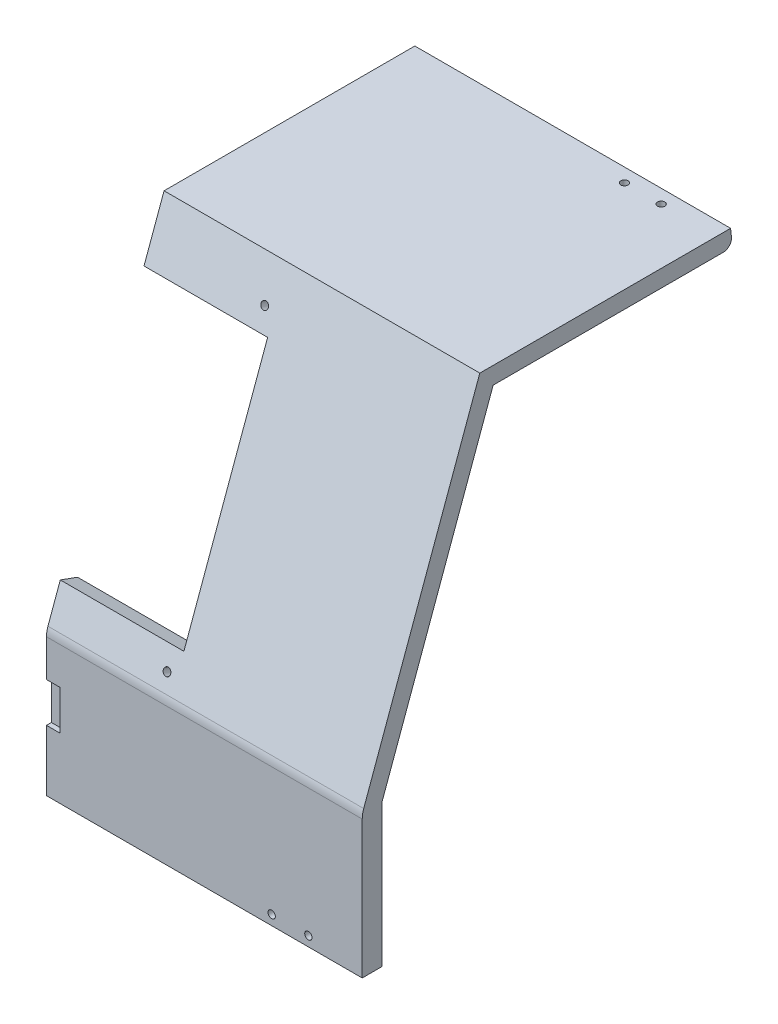
ISO-10303-21;
HEADER;
FILE_DESCRIPTION(('STEP AP214'),'2;1');
FILE_NAME('part.step','',(''),(''),'','','');
FILE_SCHEMA(('AUTOMOTIVE_DESIGN { 1 0 10303 214 1 1 1 1 }'));
ENDSEC;
DATA;
#1=APPLICATION_CONTEXT('core data for automotive mechanical design processes');
#2=APPLICATION_PROTOCOL_DEFINITION('international standard','automotive_design',2000,#1);
#3=PRODUCT_CONTEXT('',#1,'mechanical');
#4=PRODUCT('Part','Part','',(#3));
#5=PRODUCT_RELATED_PRODUCT_CATEGORY('part','',(#4));
#6=PRODUCT_DEFINITION_FORMATION('','',#4);
#7=PRODUCT_DEFINITION_CONTEXT('part definition',#1,'design');
#8=PRODUCT_DEFINITION('design','',#6,#7);
#9=PRODUCT_DEFINITION_SHAPE('','',#8);
#10=(LENGTH_UNIT() NAMED_UNIT(*) SI_UNIT(.MILLI.,.METRE.));
#11=(NAMED_UNIT(*) PLANE_ANGLE_UNIT() SI_UNIT($,.RADIAN.));
#12=(NAMED_UNIT(*) SI_UNIT($,.STERADIAN.) SOLID_ANGLE_UNIT());
#13=UNCERTAINTY_MEASURE_WITH_UNIT(LENGTH_MEASURE(1.E-05),#10,'distance_accuracy_value','');
#14=(GEOMETRIC_REPRESENTATION_CONTEXT(3) GLOBAL_UNCERTAINTY_ASSIGNED_CONTEXT((#13)) GLOBAL_UNIT_ASSIGNED_CONTEXT((#10,
#11,#12)) REPRESENTATION_CONTEXT('',''));
#15=CARTESIAN_POINT('',(0.,0.,0.));
#16=DIRECTION('',(0.,0.,1.));
#17=DIRECTION('',(1.,0.,0.));
#18=AXIS2_PLACEMENT_3D('',#15,#16,#17);
#19=CARTESIAN_POINT('',(0.,-43.,0.));
#20=DIRECTION('',(0.,-1.,0.));
#21=DIRECTION('',(1.,0.,0.));
#22=AXIS2_PLACEMENT_3D('',#19,#20,#21);
#23=PLANE('',#22);
#24=DIRECTION('',(0.,0.,1.));
#25=VECTOR('',#24,1.);
#26=CARTESIAN_POINT('',(112.,-43.,-214.));
#27=LINE('',#26,#25);
#28=CARTESIAN_POINT('',(112.,-43.,0.));
#29=VERTEX_POINT('',#28);
#30=CARTESIAN_POINT('',(112.,-43.,8.));
#31=VERTEX_POINT('',#30);
#32=EDGE_CURVE('E175',#29,#31,#27,.T.);
#33=ORIENTED_EDGE('',*,*,#32,.F.);
#34=DIRECTION('',(-1.,0.,0.));
#35=VECTOR('',#34,1.);
#36=CARTESIAN_POINT('',(372.,-43.,0.));
#37=LINE('',#36,#35);
#38=CARTESIAN_POINT('',(241.,-43.,0.));
#39=VERTEX_POINT('',#38);
#40=EDGE_CURVE('E370',#39,#29,#37,.T.);
#41=ORIENTED_EDGE('',*,*,#40,.F.);
#42=DIRECTION('',(0.,0.,-1.));
#43=VECTOR('',#42,1.);
#44=CARTESIAN_POINT('',(241.,-43.,8.));
#45=LINE('',#44,#43);
#46=CARTESIAN_POINT('',(241.,-43.,8.));
#47=VERTEX_POINT('',#46);
#48=EDGE_CURVE('E200',#47,#39,#45,.T.);
#49=ORIENTED_EDGE('',*,*,#48,.F.);
#50=DIRECTION('',(-1.,0.,0.));
#51=VECTOR('',#50,1.);
#52=CARTESIAN_POINT('',(232.,-43.,8.));
#53=LINE('',#52,#51);
#54=EDGE_CURVE('E193',#47,#31,#53,.T.);
#55=ORIENTED_EDGE('',*,*,#54,.T.);
#56=EDGE_LOOP('',(#33,#41,#49,#55));
#57=FACE_BOUND('',#56,.T.);
#58=ADVANCED_FACE('F40',(#57),#23,.T.);
#59=CARTESIAN_POINT('',(0.,0.,6.));
#60=DIRECTION('',(0.,0.,-1.));
#61=DIRECTION('',(-1.,0.,0.));
#62=AXIS2_PLACEMENT_3D('',#59,#60,#61);
#63=PLANE('',#62);
#64=DIRECTION('',(-1.,0.,0.));
#65=VECTOR('',#64,1.);
#66=CARTESIAN_POINT('',(52.5,-1.9,6.));
#67=LINE('',#66,#65);
#68=CARTESIAN_POINT('',(117.5,-1.89999999999999,6.));
#69=VERTEX_POINT('',#68);
#70=CARTESIAN_POINT('',(112.,-1.89999999999999,6.));
#71=VERTEX_POINT('',#70);
#72=EDGE_CURVE('E215',#69,#71,#67,.T.);
#73=ORIENTED_EDGE('',*,*,#72,.T.);
#74=DIRECTION('',(0.,-1.,0.));
#75=VECTOR('',#74,1.);
#76=CARTESIAN_POINT('',(112.,0.,6.));
#77=LINE('',#76,#75);
#78=CARTESIAN_POINT('',(112.,-18.1,6.));
#79=VERTEX_POINT('',#78);
#80=EDGE_CURVE('E815',#71,#79,#77,.T.);
#81=ORIENTED_EDGE('',*,*,#80,.T.);
#82=DIRECTION('',(1.,0.,0.));
#83=VECTOR('',#82,1.);
#84=CARTESIAN_POINT('',(117.5,-18.1,6.));
#85=LINE('',#84,#83);
#86=CARTESIAN_POINT('',(117.5,-18.1,6.));
#87=VERTEX_POINT('',#86);
#88=EDGE_CURVE('E219',#79,#87,#85,.T.);
#89=ORIENTED_EDGE('',*,*,#88,.T.);
#90=DIRECTION('',(0.,1.,0.));
#91=VECTOR('',#90,1.);
#92=CARTESIAN_POINT('',(117.5,-1.89999999999999,6.));
#93=LINE('',#92,#91);
#94=EDGE_CURVE('E223',#87,#69,#93,.T.);
#95=ORIENTED_EDGE('',*,*,#94,.T.);
#96=EDGE_LOOP('',(#73,#81,#89,#95));
#97=FACE_BOUND('',#96,.T.);
#98=ADVANCED_FACE('F420',(#97),#63,.F.);
#99=CARTESIAN_POINT('',(0.,0.,8.));
#100=DIRECTION('',(0.,0.,1.));
#101=DIRECTION('',(1.,0.,0.));
#102=AXIS2_PLACEMENT_3D('',#99,#100,#101);
#103=PLANE('',#102);
#104=DIRECTION('',(0.,1.,0.));
#105=VECTOR('',#104,1.);
#106=CARTESIAN_POINT('',(112.,-43.,8.));
#107=LINE('',#106,#105);
#108=CARTESIAN_POINT('',(112.,-18.1,8.));
#109=VERTEX_POINT('',#108);
#110=EDGE_CURVE('E178',#31,#109,#107,.T.);
#111=ORIENTED_EDGE('',*,*,#110,.F.);
#112=ORIENTED_EDGE('',*,*,#54,.F.);
#113=DIRECTION('',(0.,-1.,0.));
#114=VECTOR('',#113,1.);
#115=CARTESIAN_POINT('',(241.,13.2367301929154,8.));
#116=LINE('',#115,#114);
#117=CARTESIAN_POINT('',(241.,13.2367301929154,8.));
#118=VERTEX_POINT('',#117);
#119=EDGE_CURVE('E307',#118,#47,#116,.T.);
#120=ORIENTED_EDGE('',*,*,#119,.F.);
#121=DIRECTION('',(1.,0.,0.));
#122=VECTOR('',#121,1.);
#123=CARTESIAN_POINT('',(-17.,13.2367301929154,8.));
#124=LINE('',#123,#122);
#125=CARTESIAN_POINT('',(112.,13.2367301929154,8.));
#126=VERTEX_POINT('',#125);
#127=EDGE_CURVE('E264',#118,#126,#124,.F.);
#128=ORIENTED_EDGE('',*,*,#127,.T.);
#129=CARTESIAN_POINT('',(112.,-1.9,8.));
#130=VERTEX_POINT('',#129);
#131=EDGE_CURVE('E56',#130,#126,#107,.T.);
#132=ORIENTED_EDGE('',*,*,#131,.F.);
#133=DIRECTION('',(-1.,0.,0.));
#134=VECTOR('',#133,1.);
#135=CARTESIAN_POINT('',(52.5,-1.9,8.));
#136=LINE('',#135,#134);
#137=CARTESIAN_POINT('',(117.5,-1.89999999999999,8.));
#138=VERTEX_POINT('',#137);
#139=EDGE_CURVE('E203',#138,#130,#136,.T.);
#140=ORIENTED_EDGE('',*,*,#139,.F.);
#141=DIRECTION('',(0.,1.,0.));
#142=VECTOR('',#141,1.);
#143=CARTESIAN_POINT('',(117.5,-1.89999999999999,8.));
#144=LINE('',#143,#142);
#145=CARTESIAN_POINT('',(117.5,-18.1,8.));
#146=VERTEX_POINT('',#145);
#147=EDGE_CURVE('E220',#146,#138,#144,.T.);
#148=ORIENTED_EDGE('',*,*,#147,.F.);
#149=DIRECTION('',(1.,0.,0.));
#150=VECTOR('',#149,1.);
#151=CARTESIAN_POINT('',(117.5,-18.1,8.));
#152=LINE('',#151,#150);
#153=EDGE_CURVE('E196',#109,#146,#152,.T.);
#154=ORIENTED_EDGE('',*,*,#153,.F.);
#155=EDGE_LOOP('',(#111,#112,#120,#128,#132,#140,#148,#154));
#156=FACE_BOUND('',#155,.T.);
#157=CARTESIAN_POINT('',(219.,-39.,8.));
#158=DIRECTION('',(0.,0.,1.));
#159=DIRECTION('',(1.,0.,0.));
#160=AXIS2_PLACEMENT_3D('',#157,#158,#159);
#161=CIRCLE('',#160,1.5);
#162=CARTESIAN_POINT('',(220.5,-39.,8.));
#163=VERTEX_POINT('',#162);
#164=EDGE_CURVE('E281',#163,#163,#161,.T.);
#165=ORIENTED_EDGE('',*,*,#164,.F.);
#166=EDGE_LOOP('',(#165));
#167=FACE_BOUND('',#166,.T.);
#168=CARTESIAN_POINT('',(204.,-39.,8.));
#169=DIRECTION('',(0.,0.,1.));
#170=DIRECTION('',(1.,0.,0.));
#171=AXIS2_PLACEMENT_3D('',#168,#169,#170);
#172=CIRCLE('',#171,1.5);
#173=CARTESIAN_POINT('',(205.5,-39.,8.));
#174=VERTEX_POINT('',#173);
#175=EDGE_CURVE('E806',#174,#174,#172,.T.);
#176=ORIENTED_EDGE('',*,*,#175,.F.);
#177=EDGE_LOOP('',(#176));
#178=FACE_BOUND('',#177,.T.);
#179=ADVANCED_FACE('F190',(#156,#167,#178),#103,.T.);
#180=CARTESIAN_POINT('',(0.,0.,0.));
#181=DIRECTION('',(0.,0.,1.));
#182=DIRECTION('',(1.,0.,0.));
#183=AXIS2_PLACEMENT_3D('',#180,#181,#182);
#184=PLANE('',#183);
#185=CARTESIAN_POINT('',(219.,-39.,0.));
#186=DIRECTION('',(0.,0.,1.));
#187=DIRECTION('',(1.,0.,0.));
#188=AXIS2_PLACEMENT_3D('',#185,#186,#187);
#189=CIRCLE('',#188,1.5);
#190=CARTESIAN_POINT('',(220.5,-39.,0.));
#191=VERTEX_POINT('',#190);
#192=EDGE_CURVE('E280',#191,#191,#189,.T.);
#193=ORIENTED_EDGE('',*,*,#192,.T.);
#194=EDGE_LOOP('',(#193));
#195=FACE_BOUND('',#194,.T.);
#196=CARTESIAN_POINT('',(204.,-39.,0.));
#197=DIRECTION('',(0.,0.,1.));
#198=DIRECTION('',(1.,0.,0.));
#199=AXIS2_PLACEMENT_3D('',#196,#197,#198);
#200=CIRCLE('',#199,1.5);
#201=CARTESIAN_POINT('',(205.5,-39.,0.));
#202=VERTEX_POINT('',#201);
#203=EDGE_CURVE('E277',#202,#202,#200,.T.);
#204=ORIENTED_EDGE('',*,*,#203,.T.);
#205=EDGE_LOOP('',(#204));
#206=FACE_BOUND('',#205,.T.);
#207=ORIENTED_EDGE('',*,*,#40,.T.);
#208=DIRECTION('',(0.,1.,0.));
#209=VECTOR('',#208,1.);
#210=CARTESIAN_POINT('',(112.,0.,0.));
#211=LINE('',#210,#209);
#212=CARTESIAN_POINT('',(112.,15.,0.));
#213=VERTEX_POINT('',#212);
#214=EDGE_CURVE('E181',#29,#213,#211,.T.);
#215=ORIENTED_EDGE('',*,*,#214,.T.);
#216=DIRECTION('',(1.,0.,0.));
#217=VECTOR('',#216,1.);
#218=CARTESIAN_POINT('',(0.,15.,0.));
#219=LINE('',#218,#217);
#220=CARTESIAN_POINT('',(241.,15.,0.));
#221=VERTEX_POINT('',#220);
#222=EDGE_CURVE('E236',#213,#221,#219,.T.);
#223=ORIENTED_EDGE('',*,*,#222,.T.);
#224=DIRECTION('',(0.,1.,0.));
#225=VECTOR('',#224,1.);
#226=CARTESIAN_POINT('',(241.,-43.,0.));
#227=LINE('',#226,#225);
#228=EDGE_CURVE('E313',#39,#221,#227,.T.);
#229=ORIENTED_EDGE('',*,*,#228,.F.);
#230=EDGE_LOOP('',(#207,#215,#223,#229));
#231=FACE_BOUND('',#230,.T.);
#232=ADVANCED_FACE('F433',(#195,#206,#231),#184,.F.);
#233=CARTESIAN_POINT('',(52.5,-1.9,6.));
#234=DIRECTION('',(0.,1.,0.));
#235=DIRECTION('',(-1.,0.,0.));
#236=AXIS2_PLACEMENT_3D('',#233,#234,#235);
#237=PLANE('',#236);
#238=ORIENTED_EDGE('',*,*,#139,.T.);
#239=DIRECTION('',(0.,0.,-1.));
#240=VECTOR('',#239,1.);
#241=CARTESIAN_POINT('',(112.,-1.9,6.));
#242=LINE('',#241,#240);
#243=EDGE_CURVE('E810',#130,#71,#242,.T.);
#244=ORIENTED_EDGE('',*,*,#243,.T.);
#245=ORIENTED_EDGE('',*,*,#72,.F.);
#246=DIRECTION('',(0.,0.,1.));
#247=VECTOR('',#246,1.);
#248=CARTESIAN_POINT('',(117.5,-1.89999999999999,6.));
#249=LINE('',#248,#247);
#250=EDGE_CURVE('E233',#69,#138,#249,.T.);
#251=ORIENTED_EDGE('',*,*,#250,.T.);
#252=EDGE_LOOP('',(#238,#244,#245,#251));
#253=FACE_BOUND('',#252,.T.);
#254=ADVANCED_FACE('F428',(#253),#237,.F.);
#255=CARTESIAN_POINT('',(117.5,-1.89999999999999,6.));
#256=DIRECTION('',(1.,0.,0.));
#257=DIRECTION('',(0.,1.,0.));
#258=AXIS2_PLACEMENT_3D('',#255,#256,#257);
#259=PLANE('',#258);
#260=ORIENTED_EDGE('',*,*,#147,.T.);
#261=ORIENTED_EDGE('',*,*,#250,.F.);
#262=ORIENTED_EDGE('',*,*,#94,.F.);
#263=DIRECTION('',(0.,0.,1.));
#264=VECTOR('',#263,1.);
#265=CARTESIAN_POINT('',(117.5,-18.1,6.));
#266=LINE('',#265,#264);
#267=EDGE_CURVE('E226',#87,#146,#266,.T.);
#268=ORIENTED_EDGE('',*,*,#267,.T.);
#269=EDGE_LOOP('',(#260,#261,#262,#268));
#270=FACE_BOUND('',#269,.T.);
#271=ADVANCED_FACE('F413',(#270),#259,.F.);
#272=CARTESIAN_POINT('',(117.5,-18.1,6.));
#273=DIRECTION('',(0.,-1.,0.));
#274=DIRECTION('',(1.,0.,0.));
#275=AXIS2_PLACEMENT_3D('',#272,#273,#274);
#276=PLANE('',#275);
#277=ORIENTED_EDGE('',*,*,#88,.F.);
#278=DIRECTION('',(0.,0.,1.));
#279=VECTOR('',#278,1.);
#280=CARTESIAN_POINT('',(112.,-18.1,6.));
#281=LINE('',#280,#279);
#282=EDGE_CURVE('E819',#79,#109,#281,.T.);
#283=ORIENTED_EDGE('',*,*,#282,.T.);
#284=ORIENTED_EDGE('',*,*,#153,.T.);
#285=ORIENTED_EDGE('',*,*,#267,.F.);
#286=EDGE_LOOP('',(#277,#283,#284,#285));
#287=FACE_BOUND('',#286,.T.);
#288=ADVANCED_FACE('F404',(#287),#276,.F.);
#289=CARTESIAN_POINT('',(367.966363109241,15.,8.));
#290=DIRECTION('',(0.,-0.34202014332566,-0.939692620785911));
#291=DIRECTION('',(0.,0.939692620785912,-0.34202014332566));
#292=AXIS2_PLACEMENT_3D('',#289,#290,#291);
#293=PLANE('',#292);
#294=CARTESIAN_POINT('',(158.45,22.6689355771421,5.20873572141525));
#295=DIRECTION('',(0.,0.34202014332566,0.939692620785912));
#296=DIRECTION('',(0.,-0.939692620785912,0.34202014332566));
#297=AXIS2_PLACEMENT_3D('',#294,#295,#296);
#298=CIRCLE('',#297,1.5);
#299=CARTESIAN_POINT('',(158.45,21.2593966459633,5.72176593640374));
#300=VERTEX_POINT('',#299);
#301=EDGE_CURVE('E374',#300,#300,#298,.T.);
#302=ORIENTED_EDGE('',*,*,#301,.F.);
#303=EDGE_LOOP('',(#302));
#304=FACE_BOUND('',#303,.T.);
#305=DIRECTION('',(1.,0.,0.));
#306=VECTOR('',#305,1.);
#307=CARTESIAN_POINT('',(-24.4492444073313,147.,-40.0440709231374));
#308=LINE('',#307,#306);
#309=CARTESIAN_POINT('',(112.,147.,-40.0440709231374));
#310=VERTEX_POINT('',#309);
#311=CARTESIAN_POINT('',(241.,147.,-40.0440709231374));
#312=VERTEX_POINT('',#311);
#313=EDGE_CURVE('E359',#310,#312,#308,.T.);
#314=ORIENTED_EDGE('',*,*,#313,.F.);
#315=DIRECTION('',(0.,-0.939692620785912,0.34202014332566));
#316=VECTOR('',#315,1.);
#317=CARTESIAN_POINT('',(112.,15.,8.00000000000001));
#318=LINE('',#317,#316);
#319=CARTESIAN_POINT('',(112.,124.484631039296,-31.84914680792));
#320=VERTEX_POINT('',#319);
#321=EDGE_CURVE('E459',#310,#320,#318,.T.);
#322=ORIENTED_EDGE('',*,*,#321,.T.);
#323=DIRECTION('',(-1.,0.,0.));
#324=VECTOR('',#323,1.);
#325=CARTESIAN_POINT('',(162.5,124.484631039296,-31.8491468079201));
#326=LINE('',#325,#324);
#327=CARTESIAN_POINT('',(162.5,124.484631039296,-31.8491468079201));
#328=VERTEX_POINT('',#327);
#329=EDGE_CURVE('E373',#328,#320,#326,.T.);
#330=ORIENTED_EDGE('',*,*,#329,.F.);
#331=DIRECTION('',(0.,0.939692620785912,-0.34202014332566));
#332=VECTOR('',#331,1.);
#333=CARTESIAN_POINT('',(162.5,30.5153689607045,2.35286752464598));
#334=LINE('',#333,#332);
#335=CARTESIAN_POINT('',(162.5,30.5153689607045,2.35286752464598));
#336=VERTEX_POINT('',#335);
#337=EDGE_CURVE('E385',#336,#328,#334,.T.);
#338=ORIENTED_EDGE('',*,*,#337,.F.);
#339=DIRECTION('',(1.,0.,0.));
#340=VECTOR('',#339,1.);
#341=CARTESIAN_POINT('',(-2.49999999999994,30.5153689607045,2.35286752464599));
#342=LINE('',#341,#340);
#343=CARTESIAN_POINT('',(112.,30.5153689607045,2.35286752464598));
#344=VERTEX_POINT('',#343);
#345=EDGE_CURVE('E382',#344,#336,#342,.T.);
#346=ORIENTED_EDGE('',*,*,#345,.F.);
#347=CARTESIAN_POINT('',(112.,16.656931626172,7.39692620785912));
#348=VERTEX_POINT('',#347);
#349=EDGE_CURVE('E458',#344,#348,#318,.T.);
#350=ORIENTED_EDGE('',*,*,#349,.T.);
#351=DIRECTION('',(1.,0.,0.));
#352=VECTOR('',#351,1.);
#353=CARTESIAN_POINT('',(232.,16.656931626172,7.39692620785912));
#354=LINE('',#353,#352);
#355=CARTESIAN_POINT('',(241.,16.656931626172,7.39692620785912));
#356=VERTEX_POINT('',#355);
#357=EDGE_CURVE('E258',#348,#356,#354,.T.);
#358=ORIENTED_EDGE('',*,*,#357,.T.);
#359=DIRECTION('',(0.,-0.939692620785912,0.34202014332566));
#360=VECTOR('',#359,1.);
#361=CARTESIAN_POINT('',(241.,147.,-40.0440709231374));
#362=LINE('',#361,#360);
#363=EDGE_CURVE('E334',#312,#356,#362,.T.);
#364=ORIENTED_EDGE('',*,*,#363,.F.);
#365=EDGE_LOOP('',(#314,#322,#330,#338,#346,#350,#358,#364));
#366=FACE_BOUND('',#365,.T.);
#367=CARTESIAN_POINT('',(158.45,132.331064422858,-34.7050150046893));
#368=DIRECTION('',(0.,0.34202014332566,0.939692620785912));
#369=DIRECTION('',(0.,-0.939692620785912,0.34202014332566));
#370=AXIS2_PLACEMENT_3D('',#367,#368,#369);
#371=CIRCLE('',#370,1.5);
#372=CARTESIAN_POINT('',(158.45,130.921525491679,-34.1919847897008));
#373=VERTEX_POINT('',#372);
#374=EDGE_CURVE('E247',#373,#373,#371,.T.);
#375=ORIENTED_EDGE('',*,*,#374,.F.);
#376=EDGE_LOOP('',(#375));
#377=FACE_BOUND('',#376,.T.);
#378=ADVANCED_FACE('F401',(#304,#366,#377),#293,.F.);
#379=CARTESIAN_POINT('',(367.966363109241,140.,-45.496279283274));
#380=DIRECTION('',(0.,0.34202014332566,0.939692620785911));
#381=DIRECTION('',(0.,-0.939692620785912,0.34202014332566));
#382=AXIS2_PLACEMENT_3D('',#379,#380,#381);
#383=PLANE('',#382);
#384=CARTESIAN_POINT('',(158.45,20.097785138396,-1.85544205106073));
#385=DIRECTION('',(0.,0.34202014332566,0.939692620785911));
#386=DIRECTION('',(0.,-0.939692620785912,0.34202014332566));
#387=AXIS2_PLACEMENT_3D('',#384,#385,#386);
#388=CIRCLE('',#387,1.5);
#389=CARTESIAN_POINT('',(158.45,18.6882462072172,-1.34241183607224));
#390=VERTEX_POINT('',#389);
#391=EDGE_CURVE('E211',#390,#390,#388,.T.);
#392=ORIENTED_EDGE('',*,*,#391,.T.);
#393=EDGE_LOOP('',(#392));
#394=FACE_BOUND('',#393,.T.);
#395=ORIENTED_EDGE('',*,*,#222,.F.);
#396=DIRECTION('',(0.,0.939692620785912,-0.34202014332566));
#397=VECTOR('',#396,1.);
#398=CARTESIAN_POINT('',(112.,140.,-45.496279283274));
#399=LINE('',#398,#397);
#400=CARTESIAN_POINT('',(112.,27.9442185219584,-4.71131024783));
#401=VERTEX_POINT('',#400);
#402=EDGE_CURVE('E476',#213,#401,#399,.T.);
#403=ORIENTED_EDGE('',*,*,#402,.T.);
#404=DIRECTION('',(1.,0.,0.));
#405=VECTOR('',#404,1.);
#406=CARTESIAN_POINT('',(367.966363109241,27.9442185219584,-4.71131024783001));
#407=LINE('',#406,#405);
#408=CARTESIAN_POINT('',(162.5,27.9442185219584,-4.71131024783));
#409=VERTEX_POINT('',#408);
#410=EDGE_CURVE('E242',#401,#409,#407,.T.);
#411=ORIENTED_EDGE('',*,*,#410,.T.);
#412=DIRECTION('',(0.,0.939692620785912,-0.34202014332566));
#413=VECTOR('',#412,1.);
#414=CARTESIAN_POINT('',(162.5,140.,-45.496279283274));
#415=LINE('',#414,#413);
#416=CARTESIAN_POINT('',(162.5,121.91348060055,-38.913324580396));
#417=VERTEX_POINT('',#416);
#418=EDGE_CURVE('E250',#409,#417,#415,.T.);
#419=ORIENTED_EDGE('',*,*,#418,.T.);
#420=DIRECTION('',(-1.,0.,0.));
#421=VECTOR('',#420,1.);
#422=CARTESIAN_POINT('',(367.966363109241,121.91348060055,-38.913324580396));
#423=LINE('',#422,#421);
#424=CARTESIAN_POINT('',(112.,121.91348060055,-38.913324580396));
#425=VERTEX_POINT('',#424);
#426=EDGE_CURVE('E254',#417,#425,#423,.T.);
#427=ORIENTED_EDGE('',*,*,#426,.T.);
#428=CARTESIAN_POINT('',(112.,140.,-45.496279283274));
#429=VERTEX_POINT('',#428);
#430=EDGE_CURVE('E484',#425,#429,#399,.T.);
#431=ORIENTED_EDGE('',*,*,#430,.T.);
#432=DIRECTION('',(-1.,0.,0.));
#433=VECTOR('',#432,1.);
#434=CARTESIAN_POINT('',(367.966363109241,140.,-45.496279283274));
#435=LINE('',#434,#433);
#436=CARTESIAN_POINT('',(241.,140.,-45.496279283274));
#437=VERTEX_POINT('',#436);
#438=EDGE_CURVE('E204',#437,#429,#435,.T.);
#439=ORIENTED_EDGE('',*,*,#438,.F.);
#440=DIRECTION('',(0.,0.939692620785911,-0.34202014332566));
#441=VECTOR('',#440,1.);
#442=CARTESIAN_POINT('',(241.,15.,0.));
#443=LINE('',#442,#441);
#444=EDGE_CURVE('E317',#221,#437,#443,.T.);
#445=ORIENTED_EDGE('',*,*,#444,.F.);
#446=EDGE_LOOP('',(#395,#403,#411,#419,#427,#431,#439,#445));
#447=FACE_BOUND('',#446,.T.);
#448=CARTESIAN_POINT('',(158.45,129.759913984112,-41.7691927771653));
#449=DIRECTION('',(0.,0.34202014332566,0.939692620785911));
#450=DIRECTION('',(0.,-0.939692620785912,0.34202014332566));
#451=AXIS2_PLACEMENT_3D('',#448,#449,#450);
#452=CIRCLE('',#451,1.5);
#453=CARTESIAN_POINT('',(158.45,128.350375052933,-41.2561625621768));
#454=VERTEX_POINT('',#453);
#455=EDGE_CURVE('E243',#454,#454,#452,.T.);
#456=ORIENTED_EDGE('',*,*,#455,.T.);
#457=EDGE_LOOP('',(#456));
#458=FACE_BOUND('',#457,.T.);
#459=ADVANCED_FACE('F403',(#394,#447,#458),#383,.F.);
#460=CARTESIAN_POINT('',(158.45,126.174701842996,-51.6194821788357));
#461=DIRECTION('',(0.,0.34202014332566,0.939692620785911));
#462=DIRECTION('',(0.,-0.939692620785912,0.34202014332566));
#463=AXIS2_PLACEMENT_3D('',#460,#461,#462);
#464=CYLINDRICAL_SURFACE('',#463,1.5);
#465=ORIENTED_EDGE('',*,*,#374,.T.);
#466=EDGE_LOOP('',(#465));
#467=FACE_BOUND('',#466,.T.);
#468=ORIENTED_EDGE('',*,*,#455,.F.);
#469=EDGE_LOOP('',(#468));
#470=FACE_BOUND('',#469,.T.);
#471=ADVANCED_FACE('F398',(#467,#470),#464,.F.);
#472=CARTESIAN_POINT('',(162.5,118.328268459434,-48.7636139820665));
#473=DIRECTION('',(0.,0.939692620785911,-0.34202014332566));
#474=DIRECTION('',(0.,0.34202014332566,0.939692620785912));
#475=AXIS2_PLACEMENT_3D('',#472,#473,#474);
#476=PLANE('',#475);
#477=ORIENTED_EDGE('',*,*,#329,.T.);
#478=DIRECTION('',(0.,-0.34202014332566,-0.939692620785912));
#479=VECTOR('',#478,1.);
#480=CARTESIAN_POINT('',(112.,118.328268459434,-48.7636139820665));
#481=LINE('',#480,#479);
#482=EDGE_CURVE('E480',#320,#425,#481,.T.);
#483=ORIENTED_EDGE('',*,*,#482,.T.);
#484=ORIENTED_EDGE('',*,*,#426,.F.);
#485=DIRECTION('',(0.,0.34202014332566,0.939692620785911));
#486=VECTOR('',#485,1.);
#487=CARTESIAN_POINT('',(162.5,118.328268459434,-48.7636139820665));
#488=LINE('',#487,#486);
#489=EDGE_CURVE('E378',#417,#328,#488,.T.);
#490=ORIENTED_EDGE('',*,*,#489,.T.);
#491=EDGE_LOOP('',(#477,#483,#484,#490));
#492=FACE_BOUND('',#491,.T.);
#493=ADVANCED_FACE('F525',(#492),#476,.F.);
#494=CARTESIAN_POINT('',(162.5,24.3590063808426,-14.5615996495004));
#495=DIRECTION('',(1.,0.,0.));
#496=DIRECTION('',(0.,1.,0.));
#497=AXIS2_PLACEMENT_3D('',#494,#495,#496);
#498=PLANE('',#497);
#499=DIRECTION('',(0.,0.34202014332566,0.939692620785911));
#500=VECTOR('',#499,1.);
#501=CARTESIAN_POINT('',(162.5,24.3590063808426,-14.5615996495004));
#502=LINE('',#501,#500);
#503=EDGE_CURVE('E389',#409,#336,#502,.T.);
#504=ORIENTED_EDGE('',*,*,#503,.T.);
#505=ORIENTED_EDGE('',*,*,#337,.T.);
#506=ORIENTED_EDGE('',*,*,#489,.F.);
#507=ORIENTED_EDGE('',*,*,#418,.F.);
#508=EDGE_LOOP('',(#504,#505,#506,#507));
#509=FACE_BOUND('',#508,.T.);
#510=ADVANCED_FACE('F523',(#509),#498,.F.);
#511=CARTESIAN_POINT('',(-2.49999999999994,24.3590063808426,-14.5615996495004));
#512=DIRECTION('',(0.,-0.939692620785911,0.34202014332566));
#513=DIRECTION('',(0.,-0.34202014332566,-0.939692620785912));
#514=AXIS2_PLACEMENT_3D('',#511,#512,#513);
#515=PLANE('',#514);
#516=ORIENTED_EDGE('',*,*,#410,.F.);
#517=DIRECTION('',(0.,0.34202014332566,0.939692620785912));
#518=VECTOR('',#517,1.);
#519=CARTESIAN_POINT('',(112.,24.3590063808426,-14.5615996495004));
#520=LINE('',#519,#518);
#521=EDGE_CURVE('E473',#401,#344,#520,.T.);
#522=ORIENTED_EDGE('',*,*,#521,.T.);
#523=ORIENTED_EDGE('',*,*,#345,.T.);
#524=ORIENTED_EDGE('',*,*,#503,.F.);
#525=EDGE_LOOP('',(#516,#522,#523,#524));
#526=FACE_BOUND('',#525,.T.);
#527=ADVANCED_FACE('F450',(#526),#515,.F.);
#528=CARTESIAN_POINT('',(158.45,16.5125729972802,-11.7057314527312));
#529=DIRECTION('',(0.,0.34202014332566,0.939692620785911));
#530=DIRECTION('',(0.,-0.939692620785912,0.34202014332566));
#531=AXIS2_PLACEMENT_3D('',#528,#529,#530);
#532=CYLINDRICAL_SURFACE('',#531,1.5);
#533=ORIENTED_EDGE('',*,*,#301,.T.);
#534=EDGE_LOOP('',(#533));
#535=FACE_BOUND('',#534,.T.);
#536=ORIENTED_EDGE('',*,*,#391,.F.);
#537=EDGE_LOOP('',(#536));
#538=FACE_BOUND('',#537,.T.);
#539=ADVANCED_FACE('F441',(#535,#538),#532,.F.);
#540=CARTESIAN_POINT('',(367.966363109241,13.2367301929154,-2.));
#541=DIRECTION('',(-1.,0.,0.));
#542=DIRECTION('',(0.,-1.,0.));
#543=AXIS2_PLACEMENT_3D('',#540,#541,#542);
#544=CYLINDRICAL_SURFACE('',#543,10.);
#545=CARTESIAN_POINT('',(112.,13.2367301929154,-2.));
#546=DIRECTION('',(1.,0.,0.));
#547=DIRECTION('',(0.,1.,0.));
#548=AXIS2_PLACEMENT_3D('',#545,#546,#547);
#549=CIRCLE('',#548,10.);
#550=EDGE_CURVE('E454',#126,#348,#549,.F.);
#551=ORIENTED_EDGE('',*,*,#550,.F.);
#552=ORIENTED_EDGE('',*,*,#127,.F.);
#553=CARTESIAN_POINT('',(241.,13.2367301929154,-2.00000000000013));
#554=DIRECTION('',(1.,0.,0.));
#555=DIRECTION('',(0.,0.,-1.));
#556=AXIS2_PLACEMENT_3D('',#553,#554,#555);
#557=CIRCLE('',#556,10.0000000000001);
#558=EDGE_CURVE('E338',#356,#118,#557,.T.);
#559=ORIENTED_EDGE('',*,*,#558,.F.);
#560=ORIENTED_EDGE('',*,*,#357,.F.);
#561=EDGE_LOOP('',(#551,#552,#559,#560));
#562=FACE_BOUND('',#561,.T.);
#563=ADVANCED_FACE('F438',(#562),#544,.T.);
#564=CARTESIAN_POINT('',(0.,140.,0.));
#565=DIRECTION('',(0.,1.,0.));
#566=DIRECTION('',(0.,0.,1.));
#567=AXIS2_PLACEMENT_3D('',#564,#565,#566);
#568=PLANE('',#567);
#569=CARTESIAN_POINT('',(218.25,140.,-136.876777727463));
#570=DIRECTION('',(0.,1.,0.));
#571=DIRECTION('',(0.,0.,1.));
#572=AXIS2_PLACEMENT_3D('',#569,#570,#571);
#573=CIRCLE('',#572,1.5);
#574=CARTESIAN_POINT('',(218.25,140.,-135.376777727463));
#575=VERTEX_POINT('',#574);
#576=EDGE_CURVE('E302',#575,#575,#573,.T.);
#577=ORIENTED_EDGE('',*,*,#576,.T.);
#578=EDGE_LOOP('',(#577));
#579=FACE_BOUND('',#578,.T.);
#580=CARTESIAN_POINT('',(203.25,140.,-136.876777727463));
#581=DIRECTION('',(0.,1.,0.));
#582=DIRECTION('',(0.,0.,1.));
#583=AXIS2_PLACEMENT_3D('',#580,#581,#582);
#584=CIRCLE('',#583,1.5);
#585=CARTESIAN_POINT('',(203.25,140.,-135.376777727463));
#586=VERTEX_POINT('',#585);
#587=EDGE_CURVE('E295',#586,#586,#584,.T.);
#588=ORIENTED_EDGE('',*,*,#587,.T.);
#589=EDGE_LOOP('',(#588));
#590=FACE_BOUND('',#589,.T.);
#591=ORIENTED_EDGE('',*,*,#438,.T.);
#592=DIRECTION('',(0.,0.,-1.));
#593=VECTOR('',#592,1.);
#594=CARTESIAN_POINT('',(112.,140.,0.));
#595=LINE('',#594,#593);
#596=CARTESIAN_POINT('',(112.,140.,-139.496279283274));
#597=VERTEX_POINT('',#596);
#598=EDGE_CURVE('E488',#429,#597,#595,.T.);
#599=ORIENTED_EDGE('',*,*,#598,.T.);
#600=DIRECTION('',(-1.,0.,0.));
#601=VECTOR('',#600,1.);
#602=CARTESIAN_POINT('',(0.,140.,-139.496279283274));
#603=LINE('',#602,#601);
#604=CARTESIAN_POINT('',(232.,140.,-139.496279283274));
#605=VERTEX_POINT('',#604);
#606=EDGE_CURVE('E272',#597,#605,#603,.F.);
#607=ORIENTED_EDGE('',*,*,#606,.T.);
#608=DIRECTION('',(-1.,0.,0.));
#609=VECTOR('',#608,1.);
#610=CARTESIAN_POINT('',(241.,140.,-139.496279283274));
#611=LINE('',#610,#609);
#612=CARTESIAN_POINT('',(241.,140.,-139.496279283274));
#613=VERTEX_POINT('',#612);
#614=EDGE_CURVE('E355',#613,#605,#611,.T.);
#615=ORIENTED_EDGE('',*,*,#614,.F.);
#616=DIRECTION('',(0.,0.,-1.));
#617=VECTOR('',#616,1.);
#618=CARTESIAN_POINT('',(241.,140.,-45.496279283274));
#619=LINE('',#618,#617);
#620=EDGE_CURVE('E321',#437,#613,#619,.T.);
#621=ORIENTED_EDGE('',*,*,#620,.F.);
#622=EDGE_LOOP('',(#591,#599,#607,#615,#621));
#623=FACE_BOUND('',#622,.T.);
#624=ADVANCED_FACE('F440',(#579,#590,#623),#568,.F.);
#625=CARTESIAN_POINT('',(232.,147.,-142.496279283274));
#626=DIRECTION('',(0.,0.,1.));
#627=DIRECTION('',(1.,0.,0.));
#628=AXIS2_PLACEMENT_3D('',#625,#626,#627);
#629=PLANE('',#628);
#630=DIRECTION('',(-1.,0.,0.));
#631=VECTOR('',#630,1.);
#632=CARTESIAN_POINT('',(232.,143.,-142.496279283274));
#633=LINE('',#632,#631);
#634=CARTESIAN_POINT('',(232.,143.,-142.496279283274));
#635=VERTEX_POINT('',#634);
#636=CARTESIAN_POINT('',(112.,143.,-142.496279283274));
#637=VERTEX_POINT('',#636);
#638=EDGE_CURVE('E268',#635,#637,#633,.T.);
#639=ORIENTED_EDGE('',*,*,#638,.T.);
#640=DIRECTION('',(0.,1.,0.));
#641=VECTOR('',#640,1.);
#642=CARTESIAN_POINT('',(112.,147.,-142.496279283274));
#643=LINE('',#642,#641);
#644=CARTESIAN_POINT('',(112.,147.,-142.496279283274));
#645=VERTEX_POINT('',#644);
#646=EDGE_CURVE('E63',#637,#645,#643,.T.);
#647=ORIENTED_EDGE('',*,*,#646,.T.);
#648=DIRECTION('',(-1.,0.,0.));
#649=VECTOR('',#648,1.);
#650=CARTESIAN_POINT('',(232.,147.,-142.496279283274));
#651=LINE('',#650,#649);
#652=CARTESIAN_POINT('',(232.,147.,-142.496279283274));
#653=VERTEX_POINT('',#652);
#654=EDGE_CURVE('E362',#653,#645,#651,.T.);
#655=ORIENTED_EDGE('',*,*,#654,.F.);
#656=DIRECTION('',(0.,-1.,0.));
#657=VECTOR('',#656,1.);
#658=CARTESIAN_POINT('',(232.,147.,-142.496279283274));
#659=LINE('',#658,#657);
#660=EDGE_CURVE('E366',#653,#635,#659,.T.);
#661=ORIENTED_EDGE('',*,*,#660,.T.);
#662=EDGE_LOOP('',(#639,#647,#655,#661));
#663=FACE_BOUND('',#662,.T.);
#664=ADVANCED_FACE('F447',(#663),#629,.F.);
#665=CARTESIAN_POINT('',(0.,147.,0.));
#666=DIRECTION('',(0.,1.,0.));
#667=DIRECTION('',(0.,0.,1.));
#668=AXIS2_PLACEMENT_3D('',#665,#666,#667);
#669=PLANE('',#668);
#670=DIRECTION('',(0.,0.,1.));
#671=VECTOR('',#670,1.);
#672=CARTESIAN_POINT('',(112.,147.,-214.));
#673=LINE('',#672,#671);
#674=EDGE_CURVE('E186',#645,#310,#673,.T.);
#675=ORIENTED_EDGE('',*,*,#674,.T.);
#676=ORIENTED_EDGE('',*,*,#313,.T.);
#677=DIRECTION('',(0.,0.,1.));
#678=VECTOR('',#677,1.);
#679=CARTESIAN_POINT('',(241.,147.,-142.496279283274));
#680=LINE('',#679,#678);
#681=CARTESIAN_POINT('',(241.,147.,-142.496279283274));
#682=VERTEX_POINT('',#681);
#683=EDGE_CURVE('E330',#682,#312,#680,.T.);
#684=ORIENTED_EDGE('',*,*,#683,.F.);
#685=DIRECTION('',(-1.,0.,0.));
#686=VECTOR('',#685,1.);
#687=CARTESIAN_POINT('',(241.,147.,-142.496279283274));
#688=LINE('',#687,#686);
#689=EDGE_CURVE('E342',#682,#653,#688,.T.);
#690=ORIENTED_EDGE('',*,*,#689,.T.);
#691=ORIENTED_EDGE('',*,*,#654,.T.);
#692=EDGE_LOOP('',(#675,#676,#684,#690,#691));
#693=FACE_BOUND('',#692,.T.);
#694=CARTESIAN_POINT('',(218.25,147.,-136.876777727463));
#695=DIRECTION('',(0.,1.,0.));
#696=DIRECTION('',(0.,0.,1.));
#697=AXIS2_PLACEMENT_3D('',#694,#695,#696);
#698=CIRCLE('',#697,1.5);
#699=CARTESIAN_POINT('',(218.25,147.,-135.376777727463));
#700=VERTEX_POINT('',#699);
#701=EDGE_CURVE('E289',#700,#700,#698,.T.);
#702=ORIENTED_EDGE('',*,*,#701,.F.);
#703=EDGE_LOOP('',(#702));
#704=FACE_BOUND('',#703,.T.);
#705=CARTESIAN_POINT('',(203.25,147.,-136.876777727463));
#706=DIRECTION('',(0.,1.,0.));
#707=DIRECTION('',(0.,0.,1.));
#708=AXIS2_PLACEMENT_3D('',#705,#706,#707);
#709=CIRCLE('',#708,1.5);
#710=CARTESIAN_POINT('',(203.25,147.,-135.376777727463));
#711=VERTEX_POINT('',#710);
#712=EDGE_CURVE('E284',#711,#711,#709,.T.);
#713=ORIENTED_EDGE('',*,*,#712,.F.);
#714=EDGE_LOOP('',(#713));
#715=FACE_BOUND('',#714,.T.);
#716=ADVANCED_FACE('F499',(#693,#704,#715),#669,.T.);
#717=CARTESIAN_POINT('',(232.,143.,-139.496279283274));
#718=DIRECTION('',(-1.,0.,0.));
#719=DIRECTION('',(0.,0.,1.));
#720=AXIS2_PLACEMENT_3D('',#717,#718,#719);
#721=CYLINDRICAL_SURFACE('',#720,3.);
#722=CARTESIAN_POINT('',(112.,143.,-139.496279283274));
#723=DIRECTION('',(1.,0.,0.));
#724=DIRECTION('',(0.,1.,0.));
#725=AXIS2_PLACEMENT_3D('',#722,#723,#724);
#726=CIRCLE('',#725,3.);
#727=EDGE_CURVE('E11',#637,#597,#726,.F.);
#728=ORIENTED_EDGE('',*,*,#727,.F.);
#729=ORIENTED_EDGE('',*,*,#638,.F.);
#730=CARTESIAN_POINT('',(232.,143.,-139.496279283274));
#731=DIRECTION('',(1.,0.,0.));
#732=DIRECTION('',(0.,0.,-1.));
#733=AXIS2_PLACEMENT_3D('',#730,#731,#732);
#734=CIRCLE('',#733,3.);
#735=EDGE_CURVE('E49',#605,#635,#734,.T.);
#736=ORIENTED_EDGE('',*,*,#735,.F.);
#737=ORIENTED_EDGE('',*,*,#606,.F.);
#738=EDGE_LOOP('',(#728,#729,#736,#737));
#739=FACE_BOUND('',#738,.T.);
#740=ADVANCED_FACE('F42',(#739),#721,.T.);
#741=CARTESIAN_POINT('',(241.,143.380498444189,-139.496279283274));
#742=DIRECTION('',(-1.,0.,0.));
#743=DIRECTION('',(0.,0.,1.));
#744=AXIS2_PLACEMENT_3D('',#741,#742,#743);
#745=CYLINDRICAL_SURFACE('',#744,3.38049844418865);
#746=CARTESIAN_POINT('',(232.,143.380498444189,-139.496279283274));
#747=DIRECTION('',(1.,0.,0.));
#748=DIRECTION('',(0.,0.,-1.));
#749=AXIS2_PLACEMENT_3D('',#746,#747,#748);
#750=CIRCLE('',#749,3.38049844418865);
#751=CARTESIAN_POINT('',(232.,143.380498444189,-142.876777727463));
#752=VERTEX_POINT('',#751);
#753=EDGE_CURVE('E306',#605,#752,#750,.T.);
#754=ORIENTED_EDGE('',*,*,#753,.T.);
#755=DIRECTION('',(-1.,0.,0.));
#756=VECTOR('',#755,1.);
#757=CARTESIAN_POINT('',(241.,143.380498444189,-142.876777727463));
#758=LINE('',#757,#756);
#759=CARTESIAN_POINT('',(241.,143.380498444189,-142.876777727463));
#760=VERTEX_POINT('',#759);
#761=EDGE_CURVE('E351',#760,#752,#758,.T.);
#762=ORIENTED_EDGE('',*,*,#761,.F.);
#763=CARTESIAN_POINT('',(241.,143.380498444189,-139.496279283274));
#764=DIRECTION('',(1.,0.,0.));
#765=DIRECTION('',(0.,0.,-1.));
#766=AXIS2_PLACEMENT_3D('',#763,#764,#765);
#767=CIRCLE('',#766,3.38049844418865);
#768=EDGE_CURVE('E324',#613,#760,#767,.T.);
#769=ORIENTED_EDGE('',*,*,#768,.F.);
#770=ORIENTED_EDGE('',*,*,#614,.T.);
#771=EDGE_LOOP('',(#754,#762,#769,#770));
#772=FACE_BOUND('',#771,.T.);
#773=ADVANCED_FACE('F541',(#772),#745,.T.);
#774=CARTESIAN_POINT('',(241.,143.380498444189,-142.876777727463));
#775=DIRECTION('',(0.,-0.104548438271599,0.994519795707943));
#776=DIRECTION('',(0.,-0.994519795707944,-0.104548438271599));
#777=AXIS2_PLACEMENT_3D('',#774,#775,#776);
#778=PLANE('',#777);
#779=DIRECTION('',(0.,0.994519795707943,0.104548438271599));
#780=VECTOR('',#779,1.);
#781=CARTESIAN_POINT('',(232.,143.380498444189,-142.876777727463));
#782=LINE('',#781,#780);
#783=EDGE_CURVE('E310',#752,#653,#782,.T.);
#784=ORIENTED_EDGE('',*,*,#783,.T.);
#785=ORIENTED_EDGE('',*,*,#689,.F.);
#786=DIRECTION('',(0.,0.994519795707943,0.104548438271599));
#787=VECTOR('',#786,1.);
#788=CARTESIAN_POINT('',(241.,143.380498444189,-142.876777727463));
#789=LINE('',#788,#787);
#790=EDGE_CURVE('E327',#760,#682,#789,.T.);
#791=ORIENTED_EDGE('',*,*,#790,.F.);
#792=ORIENTED_EDGE('',*,*,#761,.T.);
#793=EDGE_LOOP('',(#784,#785,#791,#792));
#794=FACE_BOUND('',#793,.T.);
#795=ADVANCED_FACE('F544',(#794),#778,.F.);
#796=CARTESIAN_POINT('',(241.,143.380498444189,-139.496279283274));
#797=DIRECTION('',(1.,0.,0.));
#798=DIRECTION('',(0.,0.,-1.));
#799=AXIS2_PLACEMENT_3D('',#796,#797,#798);
#800=PLANE('',#799);
#801=ORIENTED_EDGE('',*,*,#119,.T.);
#802=ORIENTED_EDGE('',*,*,#48,.T.);
#803=ORIENTED_EDGE('',*,*,#228,.T.);
#804=ORIENTED_EDGE('',*,*,#444,.T.);
#805=ORIENTED_EDGE('',*,*,#620,.T.);
#806=ORIENTED_EDGE('',*,*,#768,.T.);
#807=ORIENTED_EDGE('',*,*,#790,.T.);
#808=ORIENTED_EDGE('',*,*,#683,.T.);
#809=ORIENTED_EDGE('',*,*,#363,.T.);
#810=ORIENTED_EDGE('',*,*,#558,.T.);
#811=EDGE_LOOP('',(#801,#802,#803,#804,#805,#806,#807,#808,#809,#810));
#812=FACE_BOUND('',#811,.T.);
#813=ADVANCED_FACE('F463',(#812),#800,.T.);
#814=CARTESIAN_POINT('',(232.,143.380498444189,-139.496279283274));
#815=DIRECTION('',(1.,0.,0.));
#816=DIRECTION('',(0.,0.,-1.));
#817=AXIS2_PLACEMENT_3D('',#814,#815,#816);
#818=PLANE('',#817);
#819=ORIENTED_EDGE('',*,*,#753,.F.);
#820=ORIENTED_EDGE('',*,*,#735,.T.);
#821=ORIENTED_EDGE('',*,*,#660,.F.);
#822=ORIENTED_EDGE('',*,*,#783,.F.);
#823=EDGE_LOOP('',(#819,#820,#821,#822));
#824=FACE_BOUND('',#823,.T.);
#825=ADVANCED_FACE('F549',(#824),#818,.F.);
#826=CARTESIAN_POINT('',(203.25,137.,-136.876777727463));
#827=DIRECTION('',(0.,1.,0.));
#828=DIRECTION('',(0.,0.,1.));
#829=AXIS2_PLACEMENT_3D('',#826,#827,#828);
#830=CYLINDRICAL_SURFACE('',#829,1.5);
#831=ORIENTED_EDGE('',*,*,#712,.T.);
#832=EDGE_LOOP('',(#831));
#833=FACE_BOUND('',#832,.T.);
#834=ORIENTED_EDGE('',*,*,#587,.F.);
#835=EDGE_LOOP('',(#834));
#836=FACE_BOUND('',#835,.T.);
#837=ADVANCED_FACE('F552',(#833,#836),#830,.F.);
#838=CARTESIAN_POINT('',(218.25,137.,-136.876777727463));
#839=DIRECTION('',(0.,1.,0.));
#840=DIRECTION('',(0.,0.,1.));
#841=AXIS2_PLACEMENT_3D('',#838,#839,#840);
#842=CYLINDRICAL_SURFACE('',#841,1.5);
#843=ORIENTED_EDGE('',*,*,#701,.T.);
#844=EDGE_LOOP('',(#843));
#845=FACE_BOUND('',#844,.T.);
#846=ORIENTED_EDGE('',*,*,#576,.F.);
#847=EDGE_LOOP('',(#846));
#848=FACE_BOUND('',#847,.T.);
#849=ADVANCED_FACE('F558',(#845,#848),#842,.F.);
#850=CARTESIAN_POINT('',(204.,-39.,-41.));
#851=DIRECTION('',(0.,0.,1.));
#852=DIRECTION('',(1.,0.,0.));
#853=AXIS2_PLACEMENT_3D('',#850,#851,#852);
#854=CYLINDRICAL_SURFACE('',#853,1.5);
#855=ORIENTED_EDGE('',*,*,#175,.T.);
#856=EDGE_LOOP('',(#855));
#857=FACE_BOUND('',#856,.T.);
#858=ORIENTED_EDGE('',*,*,#203,.F.);
#859=EDGE_LOOP('',(#858));
#860=FACE_BOUND('',#859,.T.);
#861=ADVANCED_FACE('F561',(#857,#860),#854,.F.);
#862=CARTESIAN_POINT('',(219.,-39.,-41.));
#863=DIRECTION('',(0.,0.,1.));
#864=DIRECTION('',(1.,0.,0.));
#865=AXIS2_PLACEMENT_3D('',#862,#863,#864);
#866=CYLINDRICAL_SURFACE('',#865,1.5);
#867=ORIENTED_EDGE('',*,*,#164,.T.);
#868=EDGE_LOOP('',(#867));
#869=FACE_BOUND('',#868,.T.);
#870=ORIENTED_EDGE('',*,*,#192,.F.);
#871=EDGE_LOOP('',(#870));
#872=FACE_BOUND('',#871,.T.);
#873=ADVANCED_FACE('F565',(#869,#872),#866,.F.);
#874=CARTESIAN_POINT('',(112.,-43.,-214.));
#875=DIRECTION('',(1.,0.,0.));
#876=DIRECTION('',(0.,1.,0.));
#877=AXIS2_PLACEMENT_3D('',#874,#875,#876);
#878=PLANE('',#877);
#879=ORIENTED_EDGE('',*,*,#674,.F.);
#880=ORIENTED_EDGE('',*,*,#646,.F.);
#881=ORIENTED_EDGE('',*,*,#727,.T.);
#882=ORIENTED_EDGE('',*,*,#598,.F.);
#883=ORIENTED_EDGE('',*,*,#430,.F.);
#884=ORIENTED_EDGE('',*,*,#482,.F.);
#885=ORIENTED_EDGE('',*,*,#321,.F.);
#886=EDGE_LOOP('',(#879,#880,#881,#882,#883,#884,#885));
#887=FACE_BOUND('',#886,.T.);
#888=ADVANCED_FACE('F502',(#887),#878,.F.);
#889=ORIENTED_EDGE('',*,*,#131,.T.);
#890=ORIENTED_EDGE('',*,*,#550,.T.);
#891=ORIENTED_EDGE('',*,*,#349,.F.);
#892=ORIENTED_EDGE('',*,*,#521,.F.);
#893=ORIENTED_EDGE('',*,*,#402,.F.);
#894=ORIENTED_EDGE('',*,*,#214,.F.);
#895=ORIENTED_EDGE('',*,*,#32,.T.);
#896=ORIENTED_EDGE('',*,*,#110,.T.);
#897=ORIENTED_EDGE('',*,*,#282,.F.);
#898=ORIENTED_EDGE('',*,*,#80,.F.);
#899=ORIENTED_EDGE('',*,*,#243,.F.);
#900=EDGE_LOOP('',(#889,#890,#891,#892,#893,#894,#895,#896,#897,#898,#899));
#901=FACE_BOUND('',#900,.T.);
#902=ADVANCED_FACE('F177',(#901),#878,.F.);
#903=CLOSED_SHELL('',(#58,#98,#179,#232,#254,#271,#288,#378,#459,#471,#493,#510,#527,#539,#563,
#624,#664,#716,#740,#773,#795,#813,#825,#837,#849,#861,#873,#888,#902));
#904=MANIFOLD_SOLID_BREP('B2',#903);
#905=ADVANCED_BREP_SHAPE_REPRESENTATION('',(#18,#904),#14);
#906=SHAPE_DEFINITION_REPRESENTATION(#9,#905);
ENDSEC;
END-ISO-10303-21;
